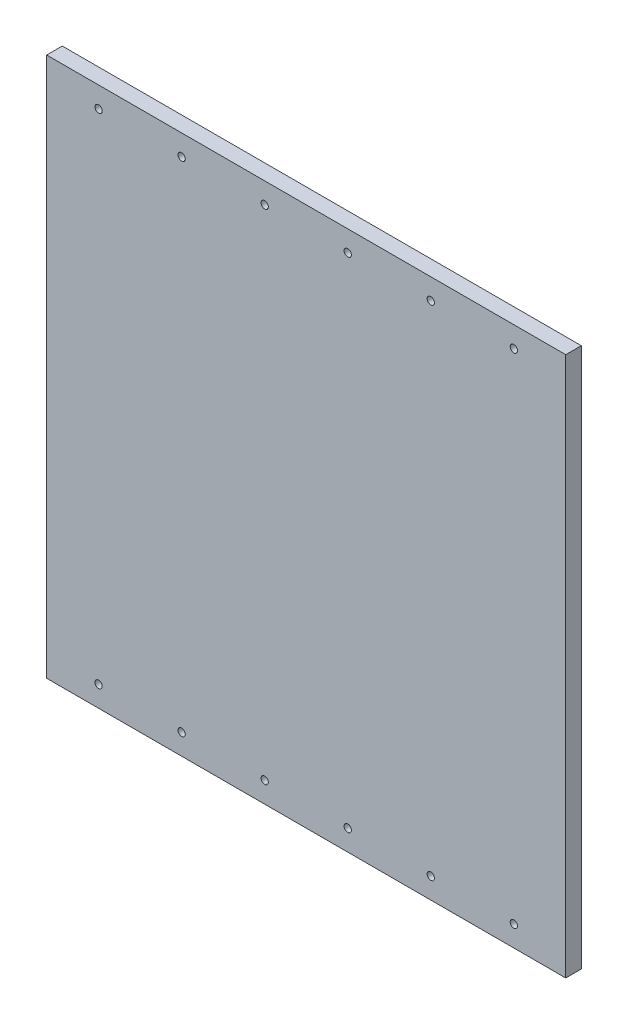
ISO-10303-21;
HEADER;
FILE_DESCRIPTION(('STEP AP214'),'2;1');
FILE_NAME('part.step','',(''),(''),'','','');
FILE_SCHEMA(('AUTOMOTIVE_DESIGN { 1 0 10303 214 1 1 1 1 }'));
ENDSEC;
DATA;
#1=APPLICATION_CONTEXT('core data for automotive mechanical design processes');
#2=APPLICATION_PROTOCOL_DEFINITION('international standard','automotive_design',2000,#1);
#3=PRODUCT_CONTEXT('',#1,'mechanical');
#4=PRODUCT('Part','Part','',(#3));
#5=PRODUCT_RELATED_PRODUCT_CATEGORY('part','',(#4));
#6=PRODUCT_DEFINITION_FORMATION('','',#4);
#7=PRODUCT_DEFINITION_CONTEXT('part definition',#1,'design');
#8=PRODUCT_DEFINITION('design','',#6,#7);
#9=PRODUCT_DEFINITION_SHAPE('','',#8);
#10=(LENGTH_UNIT() NAMED_UNIT(*) SI_UNIT(.MILLI.,.METRE.));
#11=(NAMED_UNIT(*) PLANE_ANGLE_UNIT() SI_UNIT($,.RADIAN.));
#12=(NAMED_UNIT(*) SI_UNIT($,.STERADIAN.) SOLID_ANGLE_UNIT());
#13=UNCERTAINTY_MEASURE_WITH_UNIT(LENGTH_MEASURE(1.E-05),#10,'distance_accuracy_value','');
#14=(GEOMETRIC_REPRESENTATION_CONTEXT(3) GLOBAL_UNCERTAINTY_ASSIGNED_CONTEXT((#13)) GLOBAL_UNIT_ASSIGNED_CONTEXT((#10,
#11,#12)) REPRESENTATION_CONTEXT('',''));
#15=CARTESIAN_POINT('',(0.,0.,0.));
#16=DIRECTION('',(0.,0.,1.));
#17=DIRECTION('',(1.,0.,0.));
#18=AXIS2_PLACEMENT_3D('',#15,#16,#17);
#19=CARTESIAN_POINT('',(0.,0.,15.));
#20=DIRECTION('',(1.,0.,0.));
#21=DIRECTION('',(0.,0.,-1.));
#22=AXIS2_PLACEMENT_3D('',#19,#20,#21);
#23=PLANE('',#22);
#24=DIRECTION('',(0.,-1.,0.));
#25=VECTOR('',#24,1.);
#26=CARTESIAN_POINT('',(0.,0.,0.));
#27=LINE('',#26,#25);
#28=CARTESIAN_POINT('',(0.,520.,0.));
#29=VERTEX_POINT('',#28);
#30=CARTESIAN_POINT('',(0.,0.,0.));
#31=VERTEX_POINT('',#30);
#32=EDGE_CURVE('E96',#29,#31,#27,.T.);
#33=ORIENTED_EDGE('',*,*,#32,.T.);
#34=DIRECTION('',(0.,0.,-1.));
#35=VECTOR('',#34,1.);
#36=CARTESIAN_POINT('',(0.,0.,15.));
#37=LINE('',#36,#35);
#38=CARTESIAN_POINT('',(0.,0.,15.));
#39=VERTEX_POINT('',#38);
#40=EDGE_CURVE('E11',#39,#31,#37,.T.);
#41=ORIENTED_EDGE('',*,*,#40,.F.);
#42=DIRECTION('',(0.,-1.,0.));
#43=VECTOR('',#42,1.);
#44=CARTESIAN_POINT('',(0.,0.,15.));
#45=LINE('',#44,#43);
#46=CARTESIAN_POINT('',(0.,520.,15.));
#47=VERTEX_POINT('',#46);
#48=EDGE_CURVE('E84',#47,#39,#45,.T.);
#49=ORIENTED_EDGE('',*,*,#48,.F.);
#50=DIRECTION('',(0.,0.,-1.));
#51=VECTOR('',#50,1.);
#52=CARTESIAN_POINT('',(0.,520.,15.));
#53=LINE('',#52,#51);
#54=EDGE_CURVE('E92',#47,#29,#53,.T.);
#55=ORIENTED_EDGE('',*,*,#54,.T.);
#56=EDGE_LOOP('',(#33,#41,#49,#55));
#57=FACE_BOUND('',#56,.T.);
#58=ADVANCED_FACE('F33',(#57),#23,.F.);
#59=CARTESIAN_POINT('',(0.,0.,15.));
#60=DIRECTION('',(0.,1.,0.));
#61=DIRECTION('',(0.,0.,1.));
#62=AXIS2_PLACEMENT_3D('',#59,#60,#61);
#63=PLANE('',#62);
#64=DIRECTION('',(1.,0.,0.));
#65=VECTOR('',#64,1.);
#66=CARTESIAN_POINT('',(0.,0.,0.));
#67=LINE('',#66,#65);
#68=CARTESIAN_POINT('',(500.,0.,0.));
#69=VERTEX_POINT('',#68);
#70=EDGE_CURVE('E88',#31,#69,#67,.T.);
#71=ORIENTED_EDGE('',*,*,#70,.T.);
#72=DIRECTION('',(0.,0.,-1.));
#73=VECTOR('',#72,1.);
#74=CARTESIAN_POINT('',(500.,0.,15.));
#75=LINE('',#74,#73);
#76=CARTESIAN_POINT('',(500.,0.,15.));
#77=VERTEX_POINT('',#76);
#78=EDGE_CURVE('E41',#77,#69,#75,.T.);
#79=ORIENTED_EDGE('',*,*,#78,.F.);
#80=DIRECTION('',(1.,0.,0.));
#81=VECTOR('',#80,1.);
#82=CARTESIAN_POINT('',(0.,0.,15.));
#83=LINE('',#82,#81);
#84=EDGE_CURVE('E79',#39,#77,#83,.T.);
#85=ORIENTED_EDGE('',*,*,#84,.F.);
#86=ORIENTED_EDGE('',*,*,#40,.T.);
#87=EDGE_LOOP('',(#71,#79,#85,#86));
#88=FACE_BOUND('',#87,.T.);
#89=ADVANCED_FACE('F87',(#88),#63,.F.);
#90=CARTESIAN_POINT('',(500.,0.,15.));
#91=DIRECTION('',(-1.,0.,0.));
#92=DIRECTION('',(0.,0.,1.));
#93=AXIS2_PLACEMENT_3D('',#90,#91,#92);
#94=PLANE('',#93);
#95=DIRECTION('',(0.,1.,0.));
#96=VECTOR('',#95,1.);
#97=CARTESIAN_POINT('',(500.,0.,0.));
#98=LINE('',#97,#96);
#99=CARTESIAN_POINT('',(500.,520.,0.));
#100=VERTEX_POINT('',#99);
#101=EDGE_CURVE('E66',#69,#100,#98,.T.);
#102=ORIENTED_EDGE('',*,*,#101,.T.);
#103=DIRECTION('',(0.,0.,-1.));
#104=VECTOR('',#103,1.);
#105=CARTESIAN_POINT('',(500.,520.,15.));
#106=LINE('',#105,#104);
#107=CARTESIAN_POINT('',(500.,520.,15.));
#108=VERTEX_POINT('',#107);
#109=EDGE_CURVE('E89',#108,#100,#106,.T.);
#110=ORIENTED_EDGE('',*,*,#109,.F.);
#111=DIRECTION('',(0.,1.,0.));
#112=VECTOR('',#111,1.);
#113=CARTESIAN_POINT('',(500.,0.,15.));
#114=LINE('',#113,#112);
#115=EDGE_CURVE('E82',#77,#108,#114,.T.);
#116=ORIENTED_EDGE('',*,*,#115,.F.);
#117=ORIENTED_EDGE('',*,*,#78,.T.);
#118=EDGE_LOOP('',(#102,#110,#116,#117));
#119=FACE_BOUND('',#118,.T.);
#120=ADVANCED_FACE('F90',(#119),#94,.F.);
#121=CARTESIAN_POINT('',(0.,520.,15.));
#122=DIRECTION('',(0.,-1.,0.));
#123=DIRECTION('',(0.,0.,-1.));
#124=AXIS2_PLACEMENT_3D('',#121,#122,#123);
#125=PLANE('',#124);
#126=DIRECTION('',(-1.,0.,0.));
#127=VECTOR('',#126,1.);
#128=CARTESIAN_POINT('',(0.,520.,0.));
#129=LINE('',#128,#127);
#130=EDGE_CURVE('E72',#100,#29,#129,.T.);
#131=ORIENTED_EDGE('',*,*,#130,.T.);
#132=ORIENTED_EDGE('',*,*,#54,.F.);
#133=DIRECTION('',(-1.,0.,0.));
#134=VECTOR('',#133,1.);
#135=CARTESIAN_POINT('',(0.,520.,15.));
#136=LINE('',#135,#134);
#137=EDGE_CURVE('E49',#108,#47,#136,.T.);
#138=ORIENTED_EDGE('',*,*,#137,.F.);
#139=ORIENTED_EDGE('',*,*,#109,.T.);
#140=EDGE_LOOP('',(#131,#132,#138,#139));
#141=FACE_BOUND('',#140,.T.);
#142=ADVANCED_FACE('F104',(#141),#125,.F.);
#143=CARTESIAN_POINT('',(0.,0.,15.));
#144=DIRECTION('',(0.,0.,-1.));
#145=DIRECTION('',(-1.,0.,0.));
#146=AXIS2_PLACEMENT_3D('',#143,#144,#145);
#147=PLANE('',#146);
#148=CARTESIAN_POINT('',(370.,500.,15.));
#149=DIRECTION('',(0.,0.,1.));
#150=DIRECTION('',(-1.,0.,0.));
#151=AXIS2_PLACEMENT_3D('',#148,#149,#150);
#152=CIRCLE('',#151,3.49999999999997);
#153=CARTESIAN_POINT('',(366.5,500.,15.));
#154=VERTEX_POINT('',#153);
#155=EDGE_CURVE('E123',#154,#154,#152,.T.);
#156=ORIENTED_EDGE('',*,*,#155,.F.);
#157=EDGE_LOOP('',(#156));
#158=FACE_BOUND('',#157,.T.);
#159=CARTESIAN_POINT('',(450.,500.,15.));
#160=DIRECTION('',(0.,0.,1.));
#161=DIRECTION('',(-1.,0.,0.));
#162=AXIS2_PLACEMENT_3D('',#159,#160,#161);
#163=CIRCLE('',#162,3.50000000000007);
#164=CARTESIAN_POINT('',(446.5,500.,15.));
#165=VERTEX_POINT('',#164);
#166=EDGE_CURVE('E170',#165,#165,#163,.T.);
#167=ORIENTED_EDGE('',*,*,#166,.F.);
#168=EDGE_LOOP('',(#167));
#169=FACE_BOUND('',#168,.T.);
#170=CARTESIAN_POINT('',(50.,500.,15.));
#171=DIRECTION('',(0.,0.,1.));
#172=DIRECTION('',(1.,0.,0.));
#173=AXIS2_PLACEMENT_3D('',#170,#171,#172);
#174=CIRCLE('',#173,3.5);
#175=CARTESIAN_POINT('',(53.5,500.,15.));
#176=VERTEX_POINT('',#175);
#177=EDGE_CURVE('E176',#176,#176,#174,.T.);
#178=ORIENTED_EDGE('',*,*,#177,.F.);
#179=EDGE_LOOP('',(#178));
#180=FACE_BOUND('',#179,.T.);
#181=CARTESIAN_POINT('',(130.,500.,15.));
#182=DIRECTION('',(0.,0.,1.));
#183=DIRECTION('',(1.,0.,0.));
#184=AXIS2_PLACEMENT_3D('',#181,#182,#183);
#185=CIRCLE('',#184,3.49999999999999);
#186=CARTESIAN_POINT('',(133.5,500.,15.));
#187=VERTEX_POINT('',#186);
#188=EDGE_CURVE('E153',#187,#187,#185,.T.);
#189=ORIENTED_EDGE('',*,*,#188,.F.);
#190=EDGE_LOOP('',(#189));
#191=FACE_BOUND('',#190,.T.);
#192=CARTESIAN_POINT('',(290.,500.,15.));
#193=DIRECTION('',(0.,0.,1.));
#194=DIRECTION('',(-1.,0.,0.));
#195=AXIS2_PLACEMENT_3D('',#192,#193,#194);
#196=CIRCLE('',#195,3.50000000000002);
#197=CARTESIAN_POINT('',(286.5,500.,15.));
#198=VERTEX_POINT('',#197);
#199=EDGE_CURVE('E160',#198,#198,#196,.T.);
#200=ORIENTED_EDGE('',*,*,#199,.F.);
#201=EDGE_LOOP('',(#200));
#202=FACE_BOUND('',#201,.T.);
#203=CARTESIAN_POINT('',(210.,20.,15.));
#204=DIRECTION('',(0.,0.,1.));
#205=DIRECTION('',(-1.,0.,0.));
#206=AXIS2_PLACEMENT_3D('',#203,#204,#205);
#207=CIRCLE('',#206,3.50000000000002);
#208=CARTESIAN_POINT('',(206.5,20.,15.));
#209=VERTEX_POINT('',#208);
#210=EDGE_CURVE('E136',#209,#209,#207,.T.);
#211=ORIENTED_EDGE('',*,*,#210,.F.);
#212=EDGE_LOOP('',(#211));
#213=FACE_BOUND('',#212,.T.);
#214=CARTESIAN_POINT('',(290.,20.,15.));
#215=DIRECTION('',(0.,0.,1.));
#216=DIRECTION('',(1.,0.,0.));
#217=AXIS2_PLACEMENT_3D('',#214,#215,#216);
#218=CIRCLE('',#217,3.50000000000002);
#219=CARTESIAN_POINT('',(293.5,20.,15.));
#220=VERTEX_POINT('',#219);
#221=EDGE_CURVE('E142',#220,#220,#218,.T.);
#222=ORIENTED_EDGE('',*,*,#221,.F.);
#223=EDGE_LOOP('',(#222));
#224=FACE_BOUND('',#223,.T.);
#225=CARTESIAN_POINT('',(130.,20.,15.));
#226=DIRECTION('',(0.,0.,1.));
#227=DIRECTION('',(-1.,0.,0.));
#228=AXIS2_PLACEMENT_3D('',#225,#226,#227);
#229=CIRCLE('',#228,3.49999999999999);
#230=CARTESIAN_POINT('',(126.5,20.,15.));
#231=VERTEX_POINT('',#230);
#232=EDGE_CURVE('E148',#231,#231,#229,.T.);
#233=ORIENTED_EDGE('',*,*,#232,.F.);
#234=EDGE_LOOP('',(#233));
#235=FACE_BOUND('',#234,.T.);
#236=CARTESIAN_POINT('',(370.,20.,15.));
#237=DIRECTION('',(0.,0.,1.));
#238=DIRECTION('',(1.,0.,0.));
#239=AXIS2_PLACEMENT_3D('',#236,#237,#238);
#240=CIRCLE('',#239,3.49999999999996);
#241=CARTESIAN_POINT('',(373.5,20.,15.));
#242=VERTEX_POINT('',#241);
#243=EDGE_CURVE('E116',#242,#242,#240,.T.);
#244=ORIENTED_EDGE('',*,*,#243,.F.);
#245=EDGE_LOOP('',(#244));
#246=FACE_BOUND('',#245,.T.);
#247=CARTESIAN_POINT('',(450.,20.0000000000001,15.));
#248=DIRECTION('',(0.,0.,1.));
#249=DIRECTION('',(1.,0.,0.));
#250=AXIS2_PLACEMENT_3D('',#247,#248,#249);
#251=CIRCLE('',#250,3.50000000000019);
#252=CARTESIAN_POINT('',(453.5,20.0000000000001,15.));
#253=VERTEX_POINT('',#252);
#254=EDGE_CURVE('E131',#253,#253,#251,.T.);
#255=ORIENTED_EDGE('',*,*,#254,.F.);
#256=EDGE_LOOP('',(#255));
#257=FACE_BOUND('',#256,.T.);
#258=CARTESIAN_POINT('',(49.9999999999999,20.0000000000001,15.));
#259=DIRECTION('',(0.,0.,1.));
#260=DIRECTION('',(-1.,0.,0.));
#261=AXIS2_PLACEMENT_3D('',#258,#259,#260);
#262=CIRCLE('',#261,3.5);
#263=CARTESIAN_POINT('',(46.4999999999999,20.0000000000001,15.));
#264=VERTEX_POINT('',#263);
#265=EDGE_CURVE('E124',#264,#264,#262,.T.);
#266=ORIENTED_EDGE('',*,*,#265,.F.);
#267=EDGE_LOOP('',(#266));
#268=FACE_BOUND('',#267,.T.);
#269=CARTESIAN_POINT('',(210.,500.,15.));
#270=DIRECTION('',(0.,0.,1.));
#271=DIRECTION('',(1.,0.,0.));
#272=AXIS2_PLACEMENT_3D('',#269,#270,#271);
#273=CIRCLE('',#272,3.50000000000002);
#274=CARTESIAN_POINT('',(213.5,500.,15.));
#275=VERTEX_POINT('',#274);
#276=EDGE_CURVE('E110',#275,#275,#273,.T.);
#277=ORIENTED_EDGE('',*,*,#276,.F.);
#278=EDGE_LOOP('',(#277));
#279=FACE_BOUND('',#278,.T.);
#280=ORIENTED_EDGE('',*,*,#48,.T.);
#281=ORIENTED_EDGE('',*,*,#84,.T.);
#282=ORIENTED_EDGE('',*,*,#115,.T.);
#283=ORIENTED_EDGE('',*,*,#137,.T.);
#284=EDGE_LOOP('',(#280,#281,#282,#283));
#285=FACE_BOUND('',#284,.T.);
#286=ADVANCED_FACE('F80',(#158,#169,#180,#191,#202,#213,#224,#235,#246,#257,#268,#279,#285),
#147,.F.);
#287=CARTESIAN_POINT('',(0.,0.,0.));
#288=DIRECTION('',(0.,0.,-1.));
#289=DIRECTION('',(-1.,0.,0.));
#290=AXIS2_PLACEMENT_3D('',#287,#288,#289);
#291=PLANE('',#290);
#292=CARTESIAN_POINT('',(370.,500.,0.));
#293=DIRECTION('',(0.,0.,1.));
#294=DIRECTION('',(-1.,0.,0.));
#295=AXIS2_PLACEMENT_3D('',#292,#293,#294);
#296=CIRCLE('',#295,3.49999999999997);
#297=CARTESIAN_POINT('',(366.5,500.,0.));
#298=VERTEX_POINT('',#297);
#299=EDGE_CURVE('E167',#298,#298,#296,.T.);
#300=ORIENTED_EDGE('',*,*,#299,.T.);
#301=EDGE_LOOP('',(#300));
#302=FACE_BOUND('',#301,.T.);
#303=CARTESIAN_POINT('',(450.,500.,0.));
#304=DIRECTION('',(0.,0.,1.));
#305=DIRECTION('',(-1.,0.,0.));
#306=AXIS2_PLACEMENT_3D('',#303,#304,#305);
#307=CIRCLE('',#306,3.50000000000007);
#308=CARTESIAN_POINT('',(446.5,500.,0.));
#309=VERTEX_POINT('',#308);
#310=EDGE_CURVE('E173',#309,#309,#307,.T.);
#311=ORIENTED_EDGE('',*,*,#310,.T.);
#312=EDGE_LOOP('',(#311));
#313=FACE_BOUND('',#312,.T.);
#314=CARTESIAN_POINT('',(50.,500.,0.));
#315=DIRECTION('',(0.,0.,1.));
#316=DIRECTION('',(1.,0.,0.));
#317=AXIS2_PLACEMENT_3D('',#314,#315,#316);
#318=CIRCLE('',#317,3.5);
#319=CARTESIAN_POINT('',(53.5,500.,0.));
#320=VERTEX_POINT('',#319);
#321=EDGE_CURVE('E157',#320,#320,#318,.T.);
#322=ORIENTED_EDGE('',*,*,#321,.T.);
#323=EDGE_LOOP('',(#322));
#324=FACE_BOUND('',#323,.T.);
#325=CARTESIAN_POINT('',(130.,500.,0.));
#326=DIRECTION('',(0.,0.,1.));
#327=DIRECTION('',(1.,0.,0.));
#328=AXIS2_PLACEMENT_3D('',#325,#326,#327);
#329=CIRCLE('',#328,3.49999999999999);
#330=CARTESIAN_POINT('',(133.5,500.,0.));
#331=VERTEX_POINT('',#330);
#332=EDGE_CURVE('E156',#331,#331,#329,.T.);
#333=ORIENTED_EDGE('',*,*,#332,.T.);
#334=EDGE_LOOP('',(#333));
#335=FACE_BOUND('',#334,.T.);
#336=CARTESIAN_POINT('',(290.,500.,0.));
#337=DIRECTION('',(0.,0.,1.));
#338=DIRECTION('',(-1.,0.,0.));
#339=AXIS2_PLACEMENT_3D('',#336,#337,#338);
#340=CIRCLE('',#339,3.50000000000002);
#341=CARTESIAN_POINT('',(286.5,500.,0.));
#342=VERTEX_POINT('',#341);
#343=EDGE_CURVE('E113',#342,#342,#340,.T.);
#344=ORIENTED_EDGE('',*,*,#343,.T.);
#345=EDGE_LOOP('',(#344));
#346=FACE_BOUND('',#345,.T.);
#347=CARTESIAN_POINT('',(210.,20.,0.));
#348=DIRECTION('',(0.,0.,1.));
#349=DIRECTION('',(-1.,0.,0.));
#350=AXIS2_PLACEMENT_3D('',#347,#348,#349);
#351=CIRCLE('',#350,3.50000000000002);
#352=CARTESIAN_POINT('',(206.5,20.,0.));
#353=VERTEX_POINT('',#352);
#354=EDGE_CURVE('E139',#353,#353,#351,.T.);
#355=ORIENTED_EDGE('',*,*,#354,.T.);
#356=EDGE_LOOP('',(#355));
#357=FACE_BOUND('',#356,.T.);
#358=CARTESIAN_POINT('',(290.,20.,0.));
#359=DIRECTION('',(0.,0.,1.));
#360=DIRECTION('',(1.,0.,0.));
#361=AXIS2_PLACEMENT_3D('',#358,#359,#360);
#362=CIRCLE('',#361,3.50000000000002);
#363=CARTESIAN_POINT('',(293.5,20.,0.));
#364=VERTEX_POINT('',#363);
#365=EDGE_CURVE('E145',#364,#364,#362,.T.);
#366=ORIENTED_EDGE('',*,*,#365,.T.);
#367=EDGE_LOOP('',(#366));
#368=FACE_BOUND('',#367,.T.);
#369=CARTESIAN_POINT('',(130.,20.,0.));
#370=DIRECTION('',(0.,0.,1.));
#371=DIRECTION('',(-1.,0.,0.));
#372=AXIS2_PLACEMENT_3D('',#369,#370,#371);
#373=CIRCLE('',#372,3.49999999999999);
#374=CARTESIAN_POINT('',(126.5,20.,0.));
#375=VERTEX_POINT('',#374);
#376=EDGE_CURVE('E128',#375,#375,#373,.T.);
#377=ORIENTED_EDGE('',*,*,#376,.T.);
#378=EDGE_LOOP('',(#377));
#379=FACE_BOUND('',#378,.T.);
#380=CARTESIAN_POINT('',(370.,20.,0.));
#381=DIRECTION('',(0.,0.,1.));
#382=DIRECTION('',(1.,0.,0.));
#383=AXIS2_PLACEMENT_3D('',#380,#381,#382);
#384=CIRCLE('',#383,3.49999999999996);
#385=CARTESIAN_POINT('',(373.5,20.,0.));
#386=VERTEX_POINT('',#385);
#387=EDGE_CURVE('E119',#386,#386,#384,.T.);
#388=ORIENTED_EDGE('',*,*,#387,.T.);
#389=EDGE_LOOP('',(#388));
#390=FACE_BOUND('',#389,.T.);
#391=CARTESIAN_POINT('',(450.,20.0000000000001,0.));
#392=DIRECTION('',(0.,0.,1.));
#393=DIRECTION('',(1.,0.,0.));
#394=AXIS2_PLACEMENT_3D('',#391,#392,#393);
#395=CIRCLE('',#394,3.50000000000019);
#396=CARTESIAN_POINT('',(453.5,20.0000000000001,0.));
#397=VERTEX_POINT('',#396);
#398=EDGE_CURVE('E120',#397,#397,#395,.T.);
#399=ORIENTED_EDGE('',*,*,#398,.T.);
#400=EDGE_LOOP('',(#399));
#401=FACE_BOUND('',#400,.T.);
#402=CARTESIAN_POINT('',(49.9999999999999,20.0000000000001,0.));
#403=DIRECTION('',(0.,0.,1.));
#404=DIRECTION('',(-1.,0.,0.));
#405=AXIS2_PLACEMENT_3D('',#402,#403,#404);
#406=CIRCLE('',#405,3.5);
#407=CARTESIAN_POINT('',(46.4999999999999,20.0000000000001,0.));
#408=VERTEX_POINT('',#407);
#409=EDGE_CURVE('E127',#408,#408,#406,.T.);
#410=ORIENTED_EDGE('',*,*,#409,.T.);
#411=EDGE_LOOP('',(#410));
#412=FACE_BOUND('',#411,.T.);
#413=CARTESIAN_POINT('',(210.,500.,0.));
#414=DIRECTION('',(0.,0.,1.));
#415=DIRECTION('',(1.,0.,0.));
#416=AXIS2_PLACEMENT_3D('',#413,#414,#415);
#417=CIRCLE('',#416,3.50000000000002);
#418=CARTESIAN_POINT('',(213.5,500.,0.));
#419=VERTEX_POINT('',#418);
#420=EDGE_CURVE('E99',#419,#419,#417,.T.);
#421=ORIENTED_EDGE('',*,*,#420,.T.);
#422=EDGE_LOOP('',(#421));
#423=FACE_BOUND('',#422,.T.);
#424=ORIENTED_EDGE('',*,*,#32,.F.);
#425=ORIENTED_EDGE('',*,*,#130,.F.);
#426=ORIENTED_EDGE('',*,*,#101,.F.);
#427=ORIENTED_EDGE('',*,*,#70,.F.);
#428=EDGE_LOOP('',(#424,#425,#426,#427));
#429=FACE_BOUND('',#428,.T.);
#430=ADVANCED_FACE('F107',(#302,#313,#324,#335,#346,#357,#368,#379,#390,#401,#412,#423,#429),
#291,.T.);
#431=CARTESIAN_POINT('',(210.,500.,0.));
#432=DIRECTION('',(0.,0.,1.));
#433=DIRECTION('',(1.,0.,0.));
#434=AXIS2_PLACEMENT_3D('',#431,#432,#433);
#435=CYLINDRICAL_SURFACE('',#434,3.50000000000002);
#436=ORIENTED_EDGE('',*,*,#420,.F.);
#437=EDGE_LOOP('',(#436));
#438=FACE_BOUND('',#437,.T.);
#439=ORIENTED_EDGE('',*,*,#276,.T.);
#440=EDGE_LOOP('',(#439));
#441=FACE_BOUND('',#440,.T.);
#442=ADVANCED_FACE('F214',(#438,#441),#435,.F.);
#443=CARTESIAN_POINT('',(49.9999999999999,20.0000000000001,0.));
#444=DIRECTION('',(0.,0.,1.));
#445=DIRECTION('',(1.,0.,0.));
#446=AXIS2_PLACEMENT_3D('',#443,#444,#445);
#447=CYLINDRICAL_SURFACE('',#446,3.5);
#448=ORIENTED_EDGE('',*,*,#409,.F.);
#449=EDGE_LOOP('',(#448));
#450=FACE_BOUND('',#449,.T.);
#451=ORIENTED_EDGE('',*,*,#265,.T.);
#452=EDGE_LOOP('',(#451));
#453=FACE_BOUND('',#452,.T.);
#454=ADVANCED_FACE('F216',(#450,#453),#447,.F.);
#455=CARTESIAN_POINT('',(450.,20.0000000000001,0.));
#456=DIRECTION('',(0.,0.,1.));
#457=DIRECTION('',(1.,0.,0.));
#458=AXIS2_PLACEMENT_3D('',#455,#456,#457);
#459=CYLINDRICAL_SURFACE('',#458,3.50000000000019);
#460=ORIENTED_EDGE('',*,*,#398,.F.);
#461=EDGE_LOOP('',(#460));
#462=FACE_BOUND('',#461,.T.);
#463=ORIENTED_EDGE('',*,*,#254,.T.);
#464=EDGE_LOOP('',(#463));
#465=FACE_BOUND('',#464,.T.);
#466=ADVANCED_FACE('F223',(#462,#465),#459,.F.);
#467=CARTESIAN_POINT('',(370.,20.,0.));
#468=DIRECTION('',(0.,0.,1.));
#469=DIRECTION('',(1.,0.,0.));
#470=AXIS2_PLACEMENT_3D('',#467,#468,#469);
#471=CYLINDRICAL_SURFACE('',#470,3.49999999999996);
#472=ORIENTED_EDGE('',*,*,#387,.F.);
#473=EDGE_LOOP('',(#472));
#474=FACE_BOUND('',#473,.T.);
#475=ORIENTED_EDGE('',*,*,#243,.T.);
#476=EDGE_LOOP('',(#475));
#477=FACE_BOUND('',#476,.T.);
#478=ADVANCED_FACE('F271',(#474,#477),#471,.F.);
#479=CARTESIAN_POINT('',(130.,20.,0.));
#480=DIRECTION('',(0.,0.,1.));
#481=DIRECTION('',(1.,0.,0.));
#482=AXIS2_PLACEMENT_3D('',#479,#480,#481);
#483=CYLINDRICAL_SURFACE('',#482,3.49999999999999);
#484=ORIENTED_EDGE('',*,*,#376,.F.);
#485=EDGE_LOOP('',(#484));
#486=FACE_BOUND('',#485,.T.);
#487=ORIENTED_EDGE('',*,*,#232,.T.);
#488=EDGE_LOOP('',(#487));
#489=FACE_BOUND('',#488,.T.);
#490=ADVANCED_FACE('F281',(#486,#489),#483,.F.);
#491=CARTESIAN_POINT('',(290.,20.,0.));
#492=DIRECTION('',(0.,0.,1.));
#493=DIRECTION('',(1.,0.,0.));
#494=AXIS2_PLACEMENT_3D('',#491,#492,#493);
#495=CYLINDRICAL_SURFACE('',#494,3.50000000000002);
#496=ORIENTED_EDGE('',*,*,#365,.F.);
#497=EDGE_LOOP('',(#496));
#498=FACE_BOUND('',#497,.T.);
#499=ORIENTED_EDGE('',*,*,#221,.T.);
#500=EDGE_LOOP('',(#499));
#501=FACE_BOUND('',#500,.T.);
#502=ADVANCED_FACE('F290',(#498,#501),#495,.F.);
#503=CARTESIAN_POINT('',(210.,20.,0.));
#504=DIRECTION('',(0.,0.,1.));
#505=DIRECTION('',(1.,0.,0.));
#506=AXIS2_PLACEMENT_3D('',#503,#504,#505);
#507=CYLINDRICAL_SURFACE('',#506,3.50000000000002);
#508=ORIENTED_EDGE('',*,*,#354,.F.);
#509=EDGE_LOOP('',(#508));
#510=FACE_BOUND('',#509,.T.);
#511=ORIENTED_EDGE('',*,*,#210,.T.);
#512=EDGE_LOOP('',(#511));
#513=FACE_BOUND('',#512,.T.);
#514=ADVANCED_FACE('F300',(#510,#513),#507,.F.);
#515=CARTESIAN_POINT('',(290.,500.,0.));
#516=DIRECTION('',(0.,0.,1.));
#517=DIRECTION('',(1.,0.,0.));
#518=AXIS2_PLACEMENT_3D('',#515,#516,#517);
#519=CYLINDRICAL_SURFACE('',#518,3.50000000000002);
#520=ORIENTED_EDGE('',*,*,#343,.F.);
#521=EDGE_LOOP('',(#520));
#522=FACE_BOUND('',#521,.T.);
#523=ORIENTED_EDGE('',*,*,#199,.T.);
#524=EDGE_LOOP('',(#523));
#525=FACE_BOUND('',#524,.T.);
#526=ADVANCED_FACE('F310',(#522,#525),#519,.F.);
#527=CARTESIAN_POINT('',(130.,500.,0.));
#528=DIRECTION('',(0.,0.,1.));
#529=DIRECTION('',(1.,0.,0.));
#530=AXIS2_PLACEMENT_3D('',#527,#528,#529);
#531=CYLINDRICAL_SURFACE('',#530,3.49999999999999);
#532=ORIENTED_EDGE('',*,*,#332,.F.);
#533=EDGE_LOOP('',(#532));
#534=FACE_BOUND('',#533,.T.);
#535=ORIENTED_EDGE('',*,*,#188,.T.);
#536=EDGE_LOOP('',(#535));
#537=FACE_BOUND('',#536,.T.);
#538=ADVANCED_FACE('F188',(#534,#537),#531,.F.);
#539=CARTESIAN_POINT('',(50.,500.,0.));
#540=DIRECTION('',(0.,0.,1.));
#541=DIRECTION('',(1.,0.,0.));
#542=AXIS2_PLACEMENT_3D('',#539,#540,#541);
#543=CYLINDRICAL_SURFACE('',#542,3.5);
#544=ORIENTED_EDGE('',*,*,#321,.F.);
#545=EDGE_LOOP('',(#544));
#546=FACE_BOUND('',#545,.T.);
#547=ORIENTED_EDGE('',*,*,#177,.T.);
#548=EDGE_LOOP('',(#547));
#549=FACE_BOUND('',#548,.T.);
#550=ADVANCED_FACE('F184',(#546,#549),#543,.F.);
#551=CARTESIAN_POINT('',(450.,500.,0.));
#552=DIRECTION('',(0.,0.,1.));
#553=DIRECTION('',(1.,0.,0.));
#554=AXIS2_PLACEMENT_3D('',#551,#552,#553);
#555=CYLINDRICAL_SURFACE('',#554,3.50000000000007);
#556=ORIENTED_EDGE('',*,*,#310,.F.);
#557=EDGE_LOOP('',(#556));
#558=FACE_BOUND('',#557,.T.);
#559=ORIENTED_EDGE('',*,*,#166,.T.);
#560=EDGE_LOOP('',(#559));
#561=FACE_BOUND('',#560,.T.);
#562=ADVANCED_FACE('F187',(#558,#561),#555,.F.);
#563=CARTESIAN_POINT('',(370.,500.,0.));
#564=DIRECTION('',(0.,0.,1.));
#565=DIRECTION('',(1.,0.,0.));
#566=AXIS2_PLACEMENT_3D('',#563,#564,#565);
#567=CYLINDRICAL_SURFACE('',#566,3.49999999999997);
#568=ORIENTED_EDGE('',*,*,#299,.F.);
#569=EDGE_LOOP('',(#568));
#570=FACE_BOUND('',#569,.T.);
#571=ORIENTED_EDGE('',*,*,#155,.T.);
#572=EDGE_LOOP('',(#571));
#573=FACE_BOUND('',#572,.T.);
#574=ADVANCED_FACE('F344',(#570,#573),#567,.F.);
#575=CLOSED_SHELL('',(#58,#89,#120,#142,#286,#430,#442,#454,#466,#478,#490,#502,#514,#526,#538,
#550,#562,#574));
#576=MANIFOLD_SOLID_BREP('B2',#575);
#577=ADVANCED_BREP_SHAPE_REPRESENTATION('',(#18,#576),#14);
#578=SHAPE_DEFINITION_REPRESENTATION(#9,#577);
ENDSEC;
END-ISO-10303-21;
